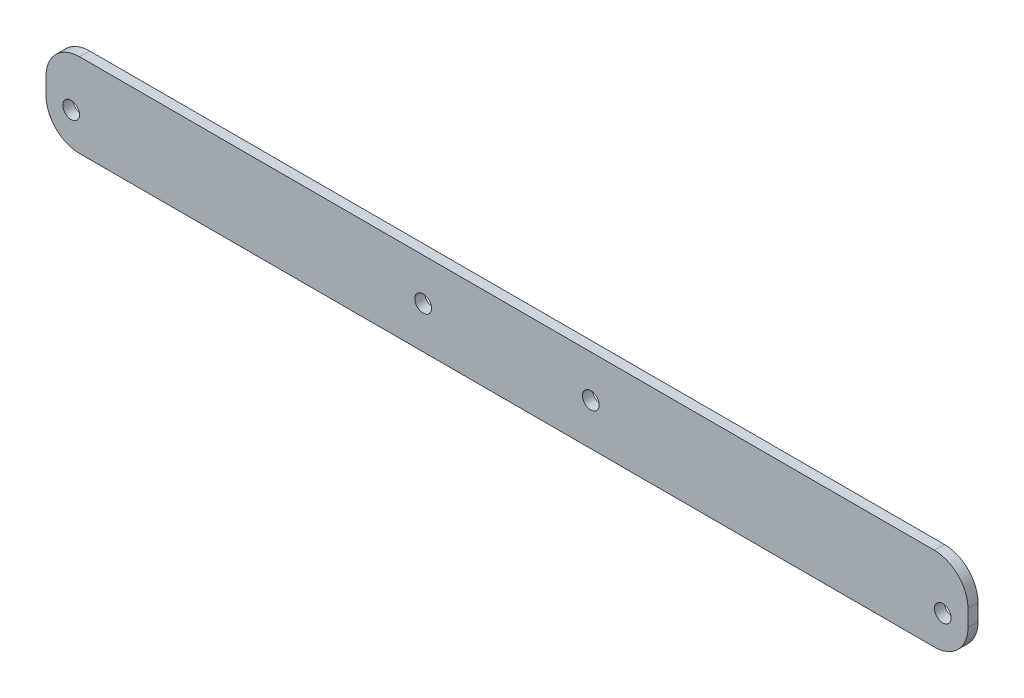
ISO-10303-21;
HEADER;
FILE_DESCRIPTION(('STEP AP214'),'2;1');
FILE_NAME('part.step','',(''),(''),'','','');
FILE_SCHEMA(('AUTOMOTIVE_DESIGN { 1 0 10303 214 1 1 1 1 }'));
ENDSEC;
DATA;
#1=APPLICATION_CONTEXT('core data for automotive mechanical design processes');
#2=APPLICATION_PROTOCOL_DEFINITION('international standard','automotive_design',2000,#1);
#3=PRODUCT_CONTEXT('',#1,'mechanical');
#4=PRODUCT('Part','Part','',(#3));
#5=PRODUCT_RELATED_PRODUCT_CATEGORY('part','',(#4));
#6=PRODUCT_DEFINITION_FORMATION('','',#4);
#7=PRODUCT_DEFINITION_CONTEXT('part definition',#1,'design');
#8=PRODUCT_DEFINITION('design','',#6,#7);
#9=PRODUCT_DEFINITION_SHAPE('','',#8);
#10=(LENGTH_UNIT() NAMED_UNIT(*) SI_UNIT(.MILLI.,.METRE.));
#11=(NAMED_UNIT(*) PLANE_ANGLE_UNIT() SI_UNIT($,.RADIAN.));
#12=(NAMED_UNIT(*) SI_UNIT($,.STERADIAN.) SOLID_ANGLE_UNIT());
#13=UNCERTAINTY_MEASURE_WITH_UNIT(LENGTH_MEASURE(1.E-05),#10,'distance_accuracy_value','');
#14=(GEOMETRIC_REPRESENTATION_CONTEXT(3) GLOBAL_UNCERTAINTY_ASSIGNED_CONTEXT((#13)) GLOBAL_UNIT_ASSIGNED_CONTEXT((#10,
#11,#12)) REPRESENTATION_CONTEXT('',''));
#15=CARTESIAN_POINT('',(0.,0.,0.));
#16=DIRECTION('',(0.,0.,1.));
#17=DIRECTION('',(1.,0.,0.));
#18=AXIS2_PLACEMENT_3D('',#15,#16,#17);
#19=CARTESIAN_POINT('',(10.,10.,3.));
#20=DIRECTION('',(0.,0.,-1.));
#21=DIRECTION('',(-1.,0.,0.));
#22=AXIS2_PLACEMENT_3D('',#19,#20,#21);
#23=PLANE('',#22);
#24=CARTESIAN_POINT('',(10.,10.,3.));
#25=DIRECTION('',(0.,0.,1.));
#26=DIRECTION('',(-1.,0.,0.));
#27=AXIS2_PLACEMENT_3D('',#24,#25,#26);
#28=CIRCLE('',#27,10.);
#29=CARTESIAN_POINT('',(0.,10.0000000000001,3.));
#30=VERTEX_POINT('',#29);
#31=CARTESIAN_POINT('',(10.0000000000001,0.,3.));
#32=VERTEX_POINT('',#31);
#33=EDGE_CURVE('E146',#30,#32,#28,.T.);
#34=ORIENTED_EDGE('',*,*,#33,.T.);
#35=DIRECTION('',(1.,0.,0.));
#36=VECTOR('',#35,1.);
#37=CARTESIAN_POINT('',(10.0000000000001,0.,3.));
#38=LINE('',#37,#36);
#39=CARTESIAN_POINT('',(265.,0.,3.));
#40=VERTEX_POINT('',#39);
#41=EDGE_CURVE('E94',#32,#40,#38,.T.);
#42=ORIENTED_EDGE('',*,*,#41,.T.);
#43=CARTESIAN_POINT('',(265.,10.,3.));
#44=DIRECTION('',(0.,0.,1.));
#45=DIRECTION('',(1.,0.,0.));
#46=AXIS2_PLACEMENT_3D('',#43,#44,#45);
#47=CIRCLE('',#46,10.);
#48=CARTESIAN_POINT('',(275.,10.,3.));
#49=VERTEX_POINT('',#48);
#50=EDGE_CURVE('E161',#40,#49,#47,.T.);
#51=ORIENTED_EDGE('',*,*,#50,.T.);
#52=DIRECTION('',(0.,1.,0.));
#53=VECTOR('',#52,1.);
#54=CARTESIAN_POINT('',(275.,10.0000000000001,3.));
#55=LINE('',#54,#53);
#56=CARTESIAN_POINT('',(275.,14.9999999999999,3.));
#57=VERTEX_POINT('',#56);
#58=EDGE_CURVE('E174',#49,#57,#55,.T.);
#59=ORIENTED_EDGE('',*,*,#58,.T.);
#60=CARTESIAN_POINT('',(265.,15.,3.));
#61=DIRECTION('',(0.,0.,1.));
#62=DIRECTION('',(-1.,0.,0.));
#63=AXIS2_PLACEMENT_3D('',#60,#61,#62);
#64=CIRCLE('',#63,10.);
#65=CARTESIAN_POINT('',(265.,25.,3.));
#66=VERTEX_POINT('',#65);
#67=EDGE_CURVE('E113',#57,#66,#64,.T.);
#68=ORIENTED_EDGE('',*,*,#67,.T.);
#69=DIRECTION('',(-1.,0.,0.));
#70=VECTOR('',#69,1.);
#71=CARTESIAN_POINT('',(10.0000000000001,25.,3.));
#72=LINE('',#71,#70);
#73=CARTESIAN_POINT('',(10.0000000000001,25.,3.));
#74=VERTEX_POINT('',#73);
#75=EDGE_CURVE('E107',#66,#74,#72,.T.);
#76=ORIENTED_EDGE('',*,*,#75,.T.);
#77=CARTESIAN_POINT('',(10.,15.,3.));
#78=DIRECTION('',(0.,0.,1.));
#79=DIRECTION('',(-1.,0.,0.));
#80=AXIS2_PLACEMENT_3D('',#77,#78,#79);
#81=CIRCLE('',#80,10.);
#82=CARTESIAN_POINT('',(0.,14.9999999999999,3.));
#83=VERTEX_POINT('',#82);
#84=EDGE_CURVE('E111',#74,#83,#81,.T.);
#85=ORIENTED_EDGE('',*,*,#84,.T.);
#86=DIRECTION('',(0.,-1.,0.));
#87=VECTOR('',#86,1.);
#88=CARTESIAN_POINT('',(0.,10.0000000000001,3.));
#89=LINE('',#88,#87);
#90=EDGE_CURVE('E51',#83,#30,#89,.T.);
#91=ORIENTED_EDGE('',*,*,#90,.T.);
#92=EDGE_LOOP('',(#34,#42,#51,#59,#68,#76,#85,#91));
#93=FACE_BOUND('',#92,.T.);
#94=CARTESIAN_POINT('',(267.5,10.,3.));
#95=DIRECTION('',(0.,0.,1.));
#96=DIRECTION('',(1.,0.,0.));
#97=AXIS2_PLACEMENT_3D('',#94,#95,#96);
#98=CIRCLE('',#97,2.50000000000002);
#99=CARTESIAN_POINT('',(270.,10.,3.));
#100=VERTEX_POINT('',#99);
#101=EDGE_CURVE('E135',#100,#100,#98,.T.);
#102=ORIENTED_EDGE('',*,*,#101,.F.);
#103=EDGE_LOOP('',(#102));
#104=FACE_BOUND('',#103,.T.);
#105=CARTESIAN_POINT('',(7.5,10.,3.));
#106=DIRECTION('',(0.,0.,1.));
#107=DIRECTION('',(1.,0.,0.));
#108=AXIS2_PLACEMENT_3D('',#105,#106,#107);
#109=CIRCLE('',#108,2.5);
#110=CARTESIAN_POINT('',(10.,10.,3.));
#111=VERTEX_POINT('',#110);
#112=EDGE_CURVE('E183',#111,#111,#109,.T.);
#113=ORIENTED_EDGE('',*,*,#112,.F.);
#114=EDGE_LOOP('',(#113));
#115=FACE_BOUND('',#114,.T.);
#116=CARTESIAN_POINT('',(112.5,12.5,3.));
#117=DIRECTION('',(0.,0.,1.));
#118=DIRECTION('',(1.,0.,0.));
#119=AXIS2_PLACEMENT_3D('',#116,#117,#118);
#120=CIRCLE('',#119,2.50000000000001);
#121=CARTESIAN_POINT('',(115.,12.5,3.));
#122=VERTEX_POINT('',#121);
#123=EDGE_CURVE('E189',#122,#122,#120,.T.);
#124=ORIENTED_EDGE('',*,*,#123,.F.);
#125=EDGE_LOOP('',(#124));
#126=FACE_BOUND('',#125,.T.);
#127=CARTESIAN_POINT('',(162.5,12.5,3.));
#128=DIRECTION('',(0.,0.,1.));
#129=DIRECTION('',(1.,0.,0.));
#130=AXIS2_PLACEMENT_3D('',#127,#128,#129);
#131=CIRCLE('',#130,2.5);
#132=CARTESIAN_POINT('',(165.,12.5,3.));
#133=VERTEX_POINT('',#132);
#134=EDGE_CURVE('E195',#133,#133,#131,.T.);
#135=ORIENTED_EDGE('',*,*,#134,.F.);
#136=EDGE_LOOP('',(#135));
#137=FACE_BOUND('',#136,.T.);
#138=ADVANCED_FACE('F34',(#93,#104,#115,#126,#137),#23,.F.);
#139=CARTESIAN_POINT('',(10.,10.,0.));
#140=DIRECTION('',(0.,0.,-1.));
#141=DIRECTION('',(-1.,0.,0.));
#142=AXIS2_PLACEMENT_3D('',#139,#140,#141);
#143=PLANE('',#142);
#144=CARTESIAN_POINT('',(112.5,12.5,0.));
#145=DIRECTION('',(0.,0.,1.));
#146=DIRECTION('',(1.,0.,0.));
#147=AXIS2_PLACEMENT_3D('',#144,#145,#146);
#148=CIRCLE('',#147,2.50000000000001);
#149=CARTESIAN_POINT('',(115.,12.5,0.));
#150=VERTEX_POINT('',#149);
#151=EDGE_CURVE('E192',#150,#150,#148,.T.);
#152=ORIENTED_EDGE('',*,*,#151,.T.);
#153=EDGE_LOOP('',(#152));
#154=FACE_BOUND('',#153,.T.);
#155=CARTESIAN_POINT('',(267.5,10.,0.));
#156=DIRECTION('',(0.,0.,1.));
#157=DIRECTION('',(1.,0.,0.));
#158=AXIS2_PLACEMENT_3D('',#155,#156,#157);
#159=CIRCLE('',#158,2.50000000000002);
#160=CARTESIAN_POINT('',(270.,10.,0.));
#161=VERTEX_POINT('',#160);
#162=EDGE_CURVE('E180',#161,#161,#159,.T.);
#163=ORIENTED_EDGE('',*,*,#162,.T.);
#164=EDGE_LOOP('',(#163));
#165=FACE_BOUND('',#164,.T.);
#166=CARTESIAN_POINT('',(10.,10.,0.));
#167=DIRECTION('',(0.,0.,1.));
#168=DIRECTION('',(-1.,0.,0.));
#169=AXIS2_PLACEMENT_3D('',#166,#167,#168);
#170=CIRCLE('',#169,10.);
#171=CARTESIAN_POINT('',(0.,10.0000000000001,0.));
#172=VERTEX_POINT('',#171);
#173=CARTESIAN_POINT('',(10.0000000000001,0.,0.));
#174=VERTEX_POINT('',#173);
#175=EDGE_CURVE('E131',#172,#174,#170,.T.);
#176=ORIENTED_EDGE('',*,*,#175,.F.);
#177=DIRECTION('',(0.,-1.,0.));
#178=VECTOR('',#177,1.);
#179=CARTESIAN_POINT('',(0.,10.0000000000001,0.));
#180=LINE('',#179,#178);
#181=CARTESIAN_POINT('',(0.,14.9999999999999,0.));
#182=VERTEX_POINT('',#181);
#183=EDGE_CURVE('E86',#182,#172,#180,.T.);
#184=ORIENTED_EDGE('',*,*,#183,.F.);
#185=CARTESIAN_POINT('',(10.,15.,0.));
#186=DIRECTION('',(0.,0.,1.));
#187=DIRECTION('',(-1.,0.,0.));
#188=AXIS2_PLACEMENT_3D('',#185,#186,#187);
#189=CIRCLE('',#188,10.);
#190=CARTESIAN_POINT('',(10.0000000000001,25.,0.));
#191=VERTEX_POINT('',#190);
#192=EDGE_CURVE('E80',#191,#182,#189,.T.);
#193=ORIENTED_EDGE('',*,*,#192,.F.);
#194=DIRECTION('',(-1.,0.,0.));
#195=VECTOR('',#194,1.);
#196=CARTESIAN_POINT('',(10.0000000000001,25.,0.));
#197=LINE('',#196,#195);
#198=CARTESIAN_POINT('',(265.,25.,0.));
#199=VERTEX_POINT('',#198);
#200=EDGE_CURVE('E121',#199,#191,#197,.T.);
#201=ORIENTED_EDGE('',*,*,#200,.F.);
#202=CARTESIAN_POINT('',(265.,15.,0.));
#203=DIRECTION('',(0.,0.,1.));
#204=DIRECTION('',(-1.,0.,0.));
#205=AXIS2_PLACEMENT_3D('',#202,#203,#204);
#206=CIRCLE('',#205,10.);
#207=CARTESIAN_POINT('',(275.,14.9999999999999,0.));
#208=VERTEX_POINT('',#207);
#209=EDGE_CURVE('E141',#208,#199,#206,.T.);
#210=ORIENTED_EDGE('',*,*,#209,.F.);
#211=DIRECTION('',(0.,1.,0.));
#212=VECTOR('',#211,1.);
#213=CARTESIAN_POINT('',(275.,10.0000000000001,0.));
#214=LINE('',#213,#212);
#215=CARTESIAN_POINT('',(275.,10.,0.));
#216=VERTEX_POINT('',#215);
#217=EDGE_CURVE('E139',#216,#208,#214,.T.);
#218=ORIENTED_EDGE('',*,*,#217,.F.);
#219=CARTESIAN_POINT('',(265.,10.,0.));
#220=DIRECTION('',(0.,0.,1.));
#221=DIRECTION('',(1.,0.,0.));
#222=AXIS2_PLACEMENT_3D('',#219,#220,#221);
#223=CIRCLE('',#222,10.);
#224=CARTESIAN_POINT('',(265.,0.,0.));
#225=VERTEX_POINT('',#224);
#226=EDGE_CURVE('E137',#225,#216,#223,.T.);
#227=ORIENTED_EDGE('',*,*,#226,.F.);
#228=DIRECTION('',(1.,0.,0.));
#229=VECTOR('',#228,1.);
#230=CARTESIAN_POINT('',(10.0000000000001,0.,0.));
#231=LINE('',#230,#229);
#232=EDGE_CURVE('E134',#174,#225,#231,.T.);
#233=ORIENTED_EDGE('',*,*,#232,.F.);
#234=EDGE_LOOP('',(#176,#184,#193,#201,#210,#218,#227,#233));
#235=FACE_BOUND('',#234,.T.);
#236=CARTESIAN_POINT('',(7.5,10.,0.));
#237=DIRECTION('',(0.,0.,1.));
#238=DIRECTION('',(1.,0.,0.));
#239=AXIS2_PLACEMENT_3D('',#236,#237,#238);
#240=CIRCLE('',#239,2.5);
#241=CARTESIAN_POINT('',(10.,10.,0.));
#242=VERTEX_POINT('',#241);
#243=EDGE_CURVE('E186',#242,#242,#240,.T.);
#244=ORIENTED_EDGE('',*,*,#243,.T.);
#245=EDGE_LOOP('',(#244));
#246=FACE_BOUND('',#245,.T.);
#247=CARTESIAN_POINT('',(162.5,12.5,0.));
#248=DIRECTION('',(0.,0.,1.));
#249=DIRECTION('',(1.,0.,0.));
#250=AXIS2_PLACEMENT_3D('',#247,#248,#249);
#251=CIRCLE('',#250,2.5);
#252=CARTESIAN_POINT('',(165.,12.5,0.));
#253=VERTEX_POINT('',#252);
#254=EDGE_CURVE('E198',#253,#253,#251,.T.);
#255=ORIENTED_EDGE('',*,*,#254,.T.);
#256=EDGE_LOOP('',(#255));
#257=FACE_BOUND('',#256,.T.);
#258=ADVANCED_FACE('F165',(#154,#165,#235,#246,#257),#143,.T.);
#259=CARTESIAN_POINT('',(10.,10.,3.));
#260=DIRECTION('',(0.,0.,-1.));
#261=DIRECTION('',(-1.,0.,0.));
#262=AXIS2_PLACEMENT_3D('',#259,#260,#261);
#263=CYLINDRICAL_SURFACE('',#262,10.);
#264=ORIENTED_EDGE('',*,*,#175,.T.);
#265=DIRECTION('',(0.,0.,-1.));
#266=VECTOR('',#265,1.);
#267=CARTESIAN_POINT('',(10.0000000000001,0.,3.));
#268=LINE('',#267,#266);
#269=EDGE_CURVE('E11',#32,#174,#268,.T.);
#270=ORIENTED_EDGE('',*,*,#269,.F.);
#271=ORIENTED_EDGE('',*,*,#33,.F.);
#272=DIRECTION('',(0.,0.,-1.));
#273=VECTOR('',#272,1.);
#274=CARTESIAN_POINT('',(0.,10.0000000000001,3.));
#275=LINE('',#274,#273);
#276=EDGE_CURVE('E127',#30,#172,#275,.T.);
#277=ORIENTED_EDGE('',*,*,#276,.T.);
#278=EDGE_LOOP('',(#264,#270,#271,#277));
#279=FACE_BOUND('',#278,.T.);
#280=ADVANCED_FACE('F36',(#279),#263,.T.);
#281=CARTESIAN_POINT('',(10.0000000000001,0.,3.));
#282=DIRECTION('',(0.,1.,0.));
#283=DIRECTION('',(0.,0.,1.));
#284=AXIS2_PLACEMENT_3D('',#281,#282,#283);
#285=PLANE('',#284);
#286=ORIENTED_EDGE('',*,*,#232,.T.);
#287=DIRECTION('',(0.,0.,-1.));
#288=VECTOR('',#287,1.);
#289=CARTESIAN_POINT('',(265.,0.,3.));
#290=LINE('',#289,#288);
#291=EDGE_CURVE('E43',#40,#225,#290,.T.);
#292=ORIENTED_EDGE('',*,*,#291,.F.);
#293=ORIENTED_EDGE('',*,*,#41,.F.);
#294=ORIENTED_EDGE('',*,*,#269,.T.);
#295=EDGE_LOOP('',(#286,#292,#293,#294));
#296=FACE_BOUND('',#295,.T.);
#297=ADVANCED_FACE('F230',(#296),#285,.F.);
#298=CARTESIAN_POINT('',(265.,10.,3.));
#299=DIRECTION('',(0.,0.,-1.));
#300=DIRECTION('',(-1.,0.,0.));
#301=AXIS2_PLACEMENT_3D('',#298,#299,#300);
#302=CYLINDRICAL_SURFACE('',#301,10.);
#303=ORIENTED_EDGE('',*,*,#226,.T.);
#304=DIRECTION('',(0.,0.,-1.));
#305=VECTOR('',#304,1.);
#306=CARTESIAN_POINT('',(275.,10.,3.));
#307=LINE('',#306,#305);
#308=EDGE_CURVE('E153',#49,#216,#307,.T.);
#309=ORIENTED_EDGE('',*,*,#308,.F.);
#310=ORIENTED_EDGE('',*,*,#50,.F.);
#311=ORIENTED_EDGE('',*,*,#291,.T.);
#312=EDGE_LOOP('',(#303,#309,#310,#311));
#313=FACE_BOUND('',#312,.T.);
#314=ADVANCED_FACE('F159',(#313),#302,.T.);
#315=CARTESIAN_POINT('',(275.,10.0000000000001,3.));
#316=DIRECTION('',(-1.,0.,0.));
#317=DIRECTION('',(0.,0.,1.));
#318=AXIS2_PLACEMENT_3D('',#315,#316,#317);
#319=PLANE('',#318);
#320=ORIENTED_EDGE('',*,*,#217,.T.);
#321=DIRECTION('',(0.,0.,-1.));
#322=VECTOR('',#321,1.);
#323=CARTESIAN_POINT('',(275.,14.9999999999999,3.));
#324=LINE('',#323,#322);
#325=EDGE_CURVE('E150',#57,#208,#324,.T.);
#326=ORIENTED_EDGE('',*,*,#325,.F.);
#327=ORIENTED_EDGE('',*,*,#58,.F.);
#328=ORIENTED_EDGE('',*,*,#308,.T.);
#329=EDGE_LOOP('',(#320,#326,#327,#328));
#330=FACE_BOUND('',#329,.T.);
#331=ADVANCED_FACE('F170',(#330),#319,.F.);
#332=CARTESIAN_POINT('',(265.,15.,3.));
#333=DIRECTION('',(0.,0.,-1.));
#334=DIRECTION('',(-1.,0.,0.));
#335=AXIS2_PLACEMENT_3D('',#332,#333,#334);
#336=CYLINDRICAL_SURFACE('',#335,10.);
#337=ORIENTED_EDGE('',*,*,#209,.T.);
#338=DIRECTION('',(0.,0.,-1.));
#339=VECTOR('',#338,1.);
#340=CARTESIAN_POINT('',(265.,25.,3.));
#341=LINE('',#340,#339);
#342=EDGE_CURVE('E122',#66,#199,#341,.T.);
#343=ORIENTED_EDGE('',*,*,#342,.F.);
#344=ORIENTED_EDGE('',*,*,#67,.F.);
#345=ORIENTED_EDGE('',*,*,#325,.T.);
#346=EDGE_LOOP('',(#337,#343,#344,#345));
#347=FACE_BOUND('',#346,.T.);
#348=ADVANCED_FACE('F173',(#347),#336,.T.);
#349=CARTESIAN_POINT('',(10.0000000000001,25.,3.));
#350=DIRECTION('',(0.,-1.,0.));
#351=DIRECTION('',(0.,0.,-1.));
#352=AXIS2_PLACEMENT_3D('',#349,#350,#351);
#353=PLANE('',#352);
#354=ORIENTED_EDGE('',*,*,#200,.T.);
#355=DIRECTION('',(0.,0.,-1.));
#356=VECTOR('',#355,1.);
#357=CARTESIAN_POINT('',(10.0000000000001,25.,3.));
#358=LINE('',#357,#356);
#359=EDGE_CURVE('E118',#74,#191,#358,.T.);
#360=ORIENTED_EDGE('',*,*,#359,.F.);
#361=ORIENTED_EDGE('',*,*,#75,.F.);
#362=ORIENTED_EDGE('',*,*,#342,.T.);
#363=EDGE_LOOP('',(#354,#360,#361,#362));
#364=FACE_BOUND('',#363,.T.);
#365=ADVANCED_FACE('F119',(#364),#353,.F.);
#366=CARTESIAN_POINT('',(10.,15.,3.));
#367=DIRECTION('',(0.,0.,-1.));
#368=DIRECTION('',(-1.,0.,0.));
#369=AXIS2_PLACEMENT_3D('',#366,#367,#368);
#370=CYLINDRICAL_SURFACE('',#369,10.);
#371=ORIENTED_EDGE('',*,*,#192,.T.);
#372=DIRECTION('',(0.,0.,-1.));
#373=VECTOR('',#372,1.);
#374=CARTESIAN_POINT('',(0.,14.9999999999999,3.));
#375=LINE('',#374,#373);
#376=EDGE_CURVE('E123',#83,#182,#375,.T.);
#377=ORIENTED_EDGE('',*,*,#376,.F.);
#378=ORIENTED_EDGE('',*,*,#84,.F.);
#379=ORIENTED_EDGE('',*,*,#359,.T.);
#380=EDGE_LOOP('',(#371,#377,#378,#379));
#381=FACE_BOUND('',#380,.T.);
#382=ADVANCED_FACE('F125',(#381),#370,.T.);
#383=CARTESIAN_POINT('',(0.,10.0000000000001,3.));
#384=DIRECTION('',(1.,0.,0.));
#385=DIRECTION('',(0.,0.,-1.));
#386=AXIS2_PLACEMENT_3D('',#383,#384,#385);
#387=PLANE('',#386);
#388=ORIENTED_EDGE('',*,*,#183,.T.);
#389=ORIENTED_EDGE('',*,*,#276,.F.);
#390=ORIENTED_EDGE('',*,*,#90,.F.);
#391=ORIENTED_EDGE('',*,*,#376,.T.);
#392=EDGE_LOOP('',(#388,#389,#390,#391));
#393=FACE_BOUND('',#392,.T.);
#394=ADVANCED_FACE('F218',(#393),#387,.F.);
#395=CARTESIAN_POINT('',(267.5,10.,3.));
#396=DIRECTION('',(0.,0.,-1.));
#397=DIRECTION('',(-1.,0.,0.));
#398=AXIS2_PLACEMENT_3D('',#395,#396,#397);
#399=CYLINDRICAL_SURFACE('',#398,2.50000000000002);
#400=ORIENTED_EDGE('',*,*,#101,.T.);
#401=EDGE_LOOP('',(#400));
#402=FACE_BOUND('',#401,.T.);
#403=ORIENTED_EDGE('',*,*,#162,.F.);
#404=EDGE_LOOP('',(#403));
#405=FACE_BOUND('',#404,.T.);
#406=ADVANCED_FACE('F215',(#402,#405),#399,.F.);
#407=CARTESIAN_POINT('',(7.5,10.,3.));
#408=DIRECTION('',(0.,0.,-1.));
#409=DIRECTION('',(-1.,0.,0.));
#410=AXIS2_PLACEMENT_3D('',#407,#408,#409);
#411=CYLINDRICAL_SURFACE('',#410,2.5);
#412=ORIENTED_EDGE('',*,*,#112,.T.);
#413=EDGE_LOOP('',(#412));
#414=FACE_BOUND('',#413,.T.);
#415=ORIENTED_EDGE('',*,*,#243,.F.);
#416=EDGE_LOOP('',(#415));
#417=FACE_BOUND('',#416,.T.);
#418=ADVANCED_FACE('F294',(#414,#417),#411,.F.);
#419=CARTESIAN_POINT('',(112.5,12.5,3.));
#420=DIRECTION('',(0.,0.,-1.));
#421=DIRECTION('',(-1.,0.,0.));
#422=AXIS2_PLACEMENT_3D('',#419,#420,#421);
#423=CYLINDRICAL_SURFACE('',#422,2.50000000000001);
#424=ORIENTED_EDGE('',*,*,#123,.T.);
#425=EDGE_LOOP('',(#424));
#426=FACE_BOUND('',#425,.T.);
#427=ORIENTED_EDGE('',*,*,#151,.F.);
#428=EDGE_LOOP('',(#427));
#429=FACE_BOUND('',#428,.T.);
#430=ADVANCED_FACE('F302',(#426,#429),#423,.F.);
#431=CARTESIAN_POINT('',(162.5,12.5,3.));
#432=DIRECTION('',(0.,0.,-1.));
#433=DIRECTION('',(-1.,0.,0.));
#434=AXIS2_PLACEMENT_3D('',#431,#432,#433);
#435=CYLINDRICAL_SURFACE('',#434,2.5);
#436=ORIENTED_EDGE('',*,*,#134,.T.);
#437=EDGE_LOOP('',(#436));
#438=FACE_BOUND('',#437,.T.);
#439=ORIENTED_EDGE('',*,*,#254,.F.);
#440=EDGE_LOOP('',(#439));
#441=FACE_BOUND('',#440,.T.);
#442=ADVANCED_FACE('F204',(#438,#441),#435,.F.);
#443=CLOSED_SHELL('',(#138,#258,#280,#297,#314,#331,#348,#365,#382,#394,#406,#418,#430,#442));
#444=MANIFOLD_SOLID_BREP('B2',#443);
#445=ADVANCED_BREP_SHAPE_REPRESENTATION('',(#18,#444),#14);
#446=SHAPE_DEFINITION_REPRESENTATION(#9,#445);
ENDSEC;
END-ISO-10303-21;
